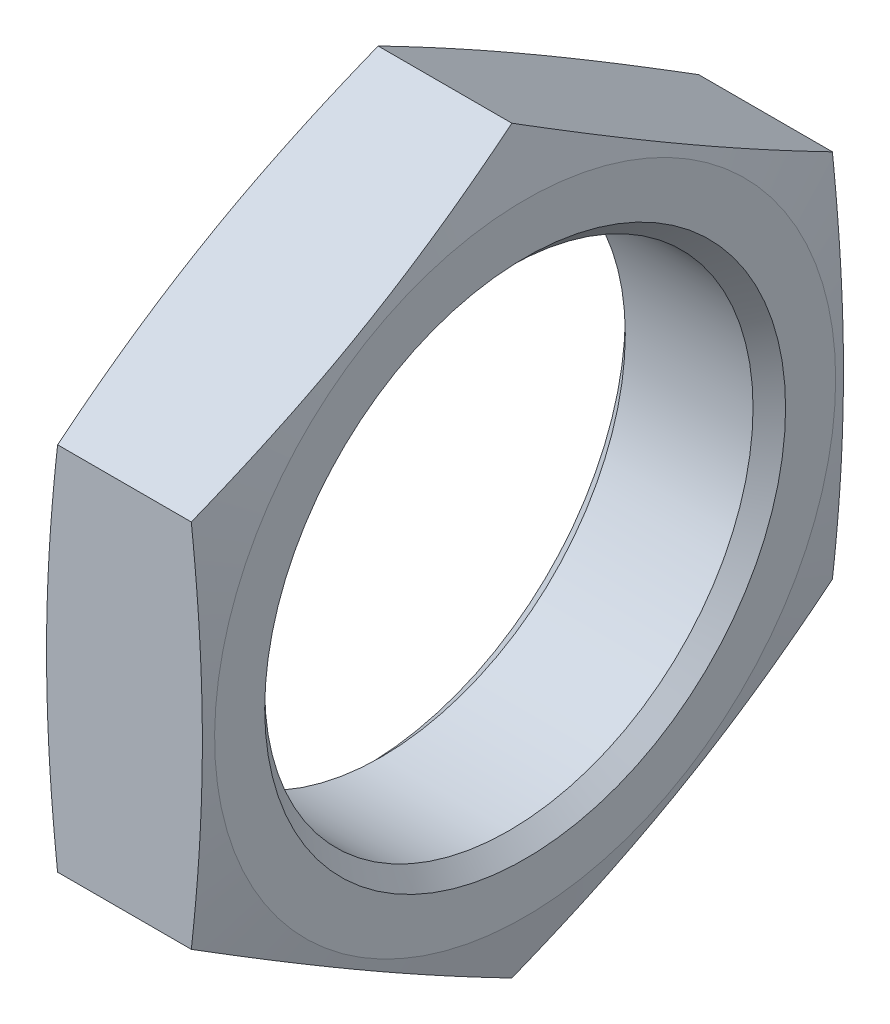
ISO-10303-21;
HEADER;
FILE_DESCRIPTION(('STEP AP214'),'2;1');
FILE_NAME('part.step','',(''),(''),'','','');
FILE_SCHEMA(('AUTOMOTIVE_DESIGN { 1 0 10303 214 1 1 1 1 }'));
ENDSEC;
DATA;
#1=APPLICATION_CONTEXT('core data for automotive mechanical design processes');
#2=APPLICATION_PROTOCOL_DEFINITION('international standard','automotive_design',2000,#1);
#3=PRODUCT_CONTEXT('',#1,'mechanical');
#4=PRODUCT('Part','Part','',(#3));
#5=PRODUCT_RELATED_PRODUCT_CATEGORY('part','',(#4));
#6=PRODUCT_DEFINITION_FORMATION('','',#4);
#7=PRODUCT_DEFINITION_CONTEXT('part definition',#1,'design');
#8=PRODUCT_DEFINITION('design','',#6,#7);
#9=PRODUCT_DEFINITION_SHAPE('','',#8);
#10=(LENGTH_UNIT() NAMED_UNIT(*) SI_UNIT(.MILLI.,.METRE.));
#11=(NAMED_UNIT(*) PLANE_ANGLE_UNIT() SI_UNIT($,.RADIAN.));
#12=(NAMED_UNIT(*) SI_UNIT($,.STERADIAN.) SOLID_ANGLE_UNIT());
#13=UNCERTAINTY_MEASURE_WITH_UNIT(LENGTH_MEASURE(1.E-05),#10,'distance_accuracy_value','');
#14=(GEOMETRIC_REPRESENTATION_CONTEXT(3) GLOBAL_UNCERTAINTY_ASSIGNED_CONTEXT((#13)) GLOBAL_UNIT_ASSIGNED_CONTEXT((#10,
#11,#12)) REPRESENTATION_CONTEXT('',''));
#15=CARTESIAN_POINT('',(0.,0.,0.));
#16=DIRECTION('',(0.,0.,1.));
#17=DIRECTION('',(1.,0.,0.));
#18=AXIS2_PLACEMENT_3D('',#15,#16,#17);
#19=CARTESIAN_POINT('',(0.,-13.,0.));
#20=DIRECTION('',(1.,0.,0.));
#21=DIRECTION('',(0.,0.,-1.));
#22=AXIS2_PLACEMENT_3D('',#19,#20,#21);
#23=PLANE('',#22);
#24=CARTESIAN_POINT('',(0.,0.,0.));
#25=DIRECTION('',(1.,0.,0.));
#26=DIRECTION('',(0.,0.,-1.));
#27=AXIS2_PLACEMENT_3D('',#24,#25,#26);
#28=CIRCLE('',#27,15.5);
#29=CARTESIAN_POINT('',(0.,0.,-15.5));
#30=VERTEX_POINT('',#29);
#31=EDGE_CURVE('E98',#30,#30,#28,.T.);
#32=ORIENTED_EDGE('',*,*,#31,.F.);
#33=EDGE_LOOP('',(#32));
#34=FACE_BOUND('',#33,.T.);
#35=CARTESIAN_POINT('',(0.,0.,0.));
#36=DIRECTION('',(1.,0.,0.));
#37=DIRECTION('',(0.,0.,-1.));
#38=AXIS2_PLACEMENT_3D('',#35,#36,#37);
#39=CIRCLE('',#38,13.);
#40=CARTESIAN_POINT('',(0.,0.,-13.));
#41=VERTEX_POINT('',#40);
#42=EDGE_CURVE('E217',#41,#41,#39,.T.);
#43=ORIENTED_EDGE('',*,*,#42,.T.);
#44=EDGE_LOOP('',(#43));
#45=FACE_BOUND('',#44,.T.);
#46=ADVANCED_FACE('F39',(#34,#45),#23,.F.);
#47=CARTESIAN_POINT('',(0.,0.,0.));
#48=DIRECTION('',(1.,0.,0.));
#49=DIRECTION('',(0.,0.,-1.));
#50=AXIS2_PLACEMENT_3D('',#47,#48,#49);
#51=CONICAL_SURFACE('',#50,15.5,1.35145307218971);
#52=CARTESIAN_POINT('',(3.08138082118048,-24.5721602463637,16.));
#53=CARTESIAN_POINT('',(2.94542948409883,-23.8442433589827,16.));
#54=CARTESIAN_POINT('',(2.8111494957726,-23.1160087423534,16.));
#55=CARTESIAN_POINT('',(2.54682523206958,-21.6587497199073,16.));
#56=CARTESIAN_POINT('',(2.41678108282317,-20.9297252912389,16.));
#57=CARTESIAN_POINT('',(2.16174598516709,-19.4702965053072,16.));
#58=CARTESIAN_POINT('',(2.03675841168863,-18.7398915562069,16.));
#59=CARTESIAN_POINT('',(1.79312680225305,-17.2780250403968,16.));
#60=CARTESIAN_POINT('',(1.67448272934855,-16.5465634798666,16.));
#61=CARTESIAN_POINT('',(1.44566080957647,-15.0864342231833,16.));
#62=CARTESIAN_POINT('',(1.33543997523493,-14.3577732964488,16.));
#63=CARTESIAN_POINT('',(1.12457472160042,-12.8990562585167,16.));
#64=CARTESIAN_POINT('',(1.02393032749282,-12.169000143655,16.));
#65=CARTESIAN_POINT('',(0.834439420296838,-10.7074069258439,16.));
#66=CARTESIAN_POINT('',(0.745591929957546,-9.97586995067187,16.));
#67=CARTESIAN_POINT('',(0.582254106535321,-8.51117723310516,16.));
#68=CARTESIAN_POINT('',(0.507763776507589,-7.77802149036609,16.));
#69=CARTESIAN_POINT('',(0.375404758541042,-6.30446452907683,16.));
#70=CARTESIAN_POINT('',(0.317669275092619,-5.56405117304472,16.));
#71=CARTESIAN_POINT('',(0.222315899806625,-4.08191882194834,16.));
#72=CARTESIAN_POINT('',(0.184697711398376,-3.34019984629336,16.));
#73=CARTESIAN_POINT('',(0.131677373971961,-1.85619022605193,16.));
#74=CARTESIAN_POINT('',(0.116268120502297,-1.11389984031248,16.));
#75=CARTESIAN_POINT('',(0.108585004053821,0.370802070375634,16.));
#76=CARTESIAN_POINT('',(0.116311108944219,1.11321359515462,16.));
#77=CARTESIAN_POINT('',(0.154469416243008,2.59937279775978,16.));
#78=CARTESIAN_POINT('',(0.184960601950223,3.34311893091831,16.));
#79=CARTESIAN_POINT('',(0.266945457863067,4.82944201998577,16.));
#80=CARTESIAN_POINT('',(0.318439426843486,5.5720189591115,16.));
#81=CARTESIAN_POINT('',(0.439866357760658,7.05597247759385,16.));
#82=CARTESIAN_POINT('',(0.509807496160809,7.79734837763225,16.));
#83=CARTESIAN_POINT('',(0.665248245131246,9.27844891219341,16.));
#84=CARTESIAN_POINT('',(0.750747886517592,10.0181735434427,16.));
#85=CARTESIAN_POINT('',(0.932841384510518,11.4821654611864,16.));
#86=CARTESIAN_POINT('',(1.02919730077095,12.206462629049,16.));
#87=CARTESIAN_POINT('',(1.23197874517596,13.6536533950972,16.));
#88=CARTESIAN_POINT('',(1.3384045041112,14.3765469607258,16.));
#89=CARTESIAN_POINT('',(1.559432015092,15.8211395146581,16.));
#90=CARTESIAN_POINT('',(1.67403446303304,16.5428383959244,16.));
#91=CARTESIAN_POINT('',(1.90986236143516,17.9851433387033,16.));
#92=CARTESIAN_POINT('',(2.03108776151939,18.7057494084856,16.));
#93=CARTESIAN_POINT('',(2.27895819689898,20.1462104505618,16.));
#94=CARTESIAN_POINT('',(2.40560457176019,20.8660651916526,16.));
#95=CARTESIAN_POINT('',(2.66330754514949,22.3049839883612,16.));
#96=CARTESIAN_POINT('',(2.79436414960298,23.0240480429153,16.));
#97=CARTESIAN_POINT('',(3.06009996520303,24.4614659139045,16.));
#98=CARTESIAN_POINT('',(3.19477898410298,25.1798197659415,16.));
#99=CARTESIAN_POINT('',(3.46715115816075,26.6159563579299,16.));
#100=CARTESIAN_POINT('',(3.60484431926878,27.3337390967511,16.));
#101=CARTESIAN_POINT('',(4.01966873780141,29.4759949293089,16.));
#102=CARTESIAN_POINT('',(4.30048012697847,30.8997553019664,16.));
#103=CARTESIAN_POINT('',(4.86912642919614,33.7458891286317,16.));
#104=CARTESIAN_POINT('',(5.15696144823449,35.168262561371,16.));
#105=CARTESIAN_POINT('',(5.73750479121511,38.0104986729067,16.));
#106=CARTESIAN_POINT('',(6.03020783227819,39.430362431922,16.));
#107=CARTESIAN_POINT('',(6.4721751989359,41.5595334664842,16.));
#108=CARTESIAN_POINT('',(6.61998124519669,42.2691441254021,16.));
#109=CARTESIAN_POINT('',(6.91645106081077,43.6881857106257,16.));
#110=CARTESIAN_POINT('',(7.06511482951659,44.3976166370666,16.));
#111=CARTESIAN_POINT('',(7.21415037216396,45.1069694875369,16.));
#112=B_SPLINE_CURVE_WITH_KNOTS('',3,(#52,#53,#54,#55,#56,#57,#58,#59,#60,#61,#62,#63,#64,#65,
#66,#67,#68,#69,#70,#71,#72,#73,#74,#75,#76,#77,#78,#79,#80,#81,#82,#83,#84,#85,#86,#87,#88,#89,
#90,#91,#92,#93,#94,#95,#96,#97,#98,#99,#100,#101,#102,#103,#104,#105,#106,#107,#108,#109,#110,
#111),.UNSPECIFIED.,.F.,.F.,(4,2,2,2,2,2,2,2,2,2,2,2,2,2,2,2,2,2,2,2,2,2,2,2,2,2,2,2,2,4),(0.,
2.2215174181477,4.44310092595417,6.66614352288232,8.88917317041034,11.0999723631927,
13.3107773700605,15.5213991202886,17.732021340936,19.9597650256971,22.1874758679878,
24.4144739260273,26.6414688911743,28.8742540111751,31.1070708947364,33.3408791127995,
35.5746917553189,37.7666414461568,39.9586413864496,42.1508281048648,44.3429981509408,
46.5357130627085,48.7284309206327,50.9210326366839,53.1136386815392,57.4671759983103,
61.8207790575721,66.1699313614857,68.3444528299292,70.5189726571143),.UNSPECIFIED.);
#113=CARTESIAN_POINT('',(0.663263066830451,-9.23760430703402,16.));
#114=VERTEX_POINT('',#113);
#115=CARTESIAN_POINT('',(0.663263066830451,9.23760430703402,16.));
#116=VERTEX_POINT('',#115);
#117=EDGE_CURVE('E171',#114,#116,#112,.T.);
#118=ORIENTED_EDGE('',*,*,#117,.T.);
#119=CARTESIAN_POINT('',(0.663288808803526,9.23748883698018,16.0002));
#120=CARTESIAN_POINT('',(0.577644596520293,9.62150569110165,15.3350632976988));
#121=CARTESIAN_POINT('',(0.499951945063873,10.0060070221062,14.6690874568211));
#122=CARTESIAN_POINT('',(0.36352252688607,10.7759503215658,13.3355065432098));
#123=CARTESIAN_POINT('',(0.304791002892421,11.1613925205382,12.6679010712086));
#124=CARTESIAN_POINT('',(0.209558157584958,11.9315952479053,11.3338708152807));
#125=CARTESIAN_POINT('',(0.172977975020494,12.3163532738543,10.6674503657171));
#126=CARTESIAN_POINT('',(0.123932964830005,13.0862097209779,9.33401988476455));
#127=CARTESIAN_POINT('',(0.111464968152866,13.4713080907645,8.66700994238228));
#128=CARTESIAN_POINT('',(0.111464968152866,14.2415048303376,7.33299005761772));
#129=CARTESIAN_POINT('',(0.123932964830005,14.6266032001241,6.66598011523545));
#130=CARTESIAN_POINT('',(0.172977975020494,15.3964596472478,5.33254963428286));
#131=CARTESIAN_POINT('',(0.209558157584958,15.7812176731967,4.66612918471935));
#132=CARTESIAN_POINT('',(0.304791002892421,16.5514204005639,3.33209892879136));
#133=CARTESIAN_POINT('',(0.36352252688607,16.9368625995362,2.66449345679022));
#134=CARTESIAN_POINT('',(0.499951945063874,17.7068058989958,1.33091254317892));
#135=CARTESIAN_POINT('',(0.577644596520294,18.0913072300004,0.664936702301148));
#136=CARTESIAN_POINT('',(0.663288808803526,18.4753240841219,-0.000199999999999242));
#137=B_SPLINE_CURVE_WITH_KNOTS('',3,(#119,#120,#121,#122,#123,#124,#125,#126,#127,#128,#129,
#130,#131,#132,#133,#134,#135,#136),.UNSPECIFIED.,.F.,.F.,(4,2,2,2,2,2,2,2,4),(0.,
2.3184642188721,4.63756894222746,6.94836809641305,9.25886352291191,11.5693589494108,
13.8801581035964,16.1992628269517,18.5177270458238),.UNSPECIFIED.);
#138=CARTESIAN_POINT('',(0.663263066830451,18.475208614068,0.));
#139=VERTEX_POINT('',#138);
#140=EDGE_CURVE('E177',#116,#139,#137,.T.);
#141=ORIENTED_EDGE('',*,*,#140,.T.);
#142=CARTESIAN_POINT('',(0.663288808803526,18.4753240841219,0.000200000000000793));
#143=CARTESIAN_POINT('',(0.577644596520294,18.0913072300004,-0.664936702301149));
#144=CARTESIAN_POINT('',(0.499951945063874,17.7068058989958,-1.33091254317892));
#145=CARTESIAN_POINT('',(0.36352252688607,16.9368625995362,-2.66449345679021));
#146=CARTESIAN_POINT('',(0.304791002892421,16.5514204005639,-3.33209892879135));
#147=CARTESIAN_POINT('',(0.209558157584958,15.7812176731967,-4.66612918471934));
#148=CARTESIAN_POINT('',(0.172977975020493,15.3964596472478,-5.33254963428286));
#149=CARTESIAN_POINT('',(0.123932964830005,14.6266032001241,-6.66598011523544));
#150=CARTESIAN_POINT('',(0.111464968152867,14.2415048303376,-7.33299005761772));
#151=CARTESIAN_POINT('',(0.111464968152867,13.4713080907645,-8.66700994238228));
#152=CARTESIAN_POINT('',(0.123932964830005,13.0862097209779,-9.33401988476455));
#153=CARTESIAN_POINT('',(0.172977975020493,12.3163532738543,-10.6674503657171));
#154=CARTESIAN_POINT('',(0.209558157584958,11.9315952479053,-11.3338708152807));
#155=CARTESIAN_POINT('',(0.304791002892421,11.1613925205382,-12.6679010712086));
#156=CARTESIAN_POINT('',(0.36352252688607,10.7759503215658,-13.3355065432098));
#157=CARTESIAN_POINT('',(0.499951945063873,10.0060070221062,-14.6690874568211));
#158=CARTESIAN_POINT('',(0.577644596520293,9.62150569110164,-15.3350632976989));
#159=CARTESIAN_POINT('',(0.663288808803526,9.23748883698018,-16.0002));
#160=B_SPLINE_CURVE_WITH_KNOTS('',3,(#142,#143,#144,#145,#146,#147,#148,#149,#150,#151,#152,
#153,#154,#155,#156,#157,#158,#159),.UNSPECIFIED.,.F.,.F.,(4,2,2,2,2,2,2,2,4),(0.,
2.3184642188721,4.63756894222746,6.94836809641305,9.25886352291191,11.5693589494108,
13.8801581035964,16.1992628269517,18.5177270458238),.UNSPECIFIED.);
#161=CARTESIAN_POINT('',(0.663263066830452,9.23760430703402,-16.));
#162=VERTEX_POINT('',#161);
#163=EDGE_CURVE('E147',#139,#162,#160,.T.);
#164=ORIENTED_EDGE('',*,*,#163,.T.);
#165=CARTESIAN_POINT('',(3.08138082118048,-24.5721602463637,-16.));
#166=CARTESIAN_POINT('',(2.94542948409883,-23.8442433589827,-16.));
#167=CARTESIAN_POINT('',(2.8111494957726,-23.1160087423534,-16.));
#168=CARTESIAN_POINT('',(2.54682523206958,-21.6587497199073,-16.));
#169=CARTESIAN_POINT('',(2.41678108282317,-20.9297252912389,-16.));
#170=CARTESIAN_POINT('',(2.16174598516709,-19.4702965053072,-16.));
#171=CARTESIAN_POINT('',(2.03675841168863,-18.7398915562069,-16.));
#172=CARTESIAN_POINT('',(1.79312680225305,-17.2780250403968,-16.));
#173=CARTESIAN_POINT('',(1.67448272934855,-16.5465634798666,-16.));
#174=CARTESIAN_POINT('',(1.44566080957647,-15.0864342231833,-16.));
#175=CARTESIAN_POINT('',(1.33543997523493,-14.3577732964488,-16.));
#176=CARTESIAN_POINT('',(1.12457472160042,-12.8990562585167,-16.));
#177=CARTESIAN_POINT('',(1.02393032749282,-12.169000143655,-16.));
#178=CARTESIAN_POINT('',(0.834439420296838,-10.7074069258439,-16.));
#179=CARTESIAN_POINT('',(0.745591929957546,-9.97586995067187,-16.));
#180=CARTESIAN_POINT('',(0.582254106535321,-8.51117723310516,-16.));
#181=CARTESIAN_POINT('',(0.507763776507589,-7.77802149036609,-16.));
#182=CARTESIAN_POINT('',(0.375404758541042,-6.30446452907683,-16.));
#183=CARTESIAN_POINT('',(0.317669275092619,-5.56405117304472,-16.));
#184=CARTESIAN_POINT('',(0.222315899806625,-4.08191882194834,-16.));
#185=CARTESIAN_POINT('',(0.184697711398376,-3.34019984629336,-16.));
#186=CARTESIAN_POINT('',(0.131677373971961,-1.85619022605193,-16.));
#187=CARTESIAN_POINT('',(0.116268120502297,-1.11389984031248,-16.));
#188=CARTESIAN_POINT('',(0.108585004053821,0.370802070375634,-16.));
#189=CARTESIAN_POINT('',(0.116311108944219,1.11321359515462,-16.));
#190=CARTESIAN_POINT('',(0.154469416243008,2.59937279775978,-16.));
#191=CARTESIAN_POINT('',(0.184960601950223,3.34311893091831,-16.));
#192=CARTESIAN_POINT('',(0.266945457863067,4.82944201998577,-16.));
#193=CARTESIAN_POINT('',(0.318439426843486,5.5720189591115,-16.));
#194=CARTESIAN_POINT('',(0.439866357760658,7.05597247759385,-16.));
#195=CARTESIAN_POINT('',(0.509807496160809,7.79734837763225,-16.));
#196=CARTESIAN_POINT('',(0.665248245131246,9.27844891219341,-16.));
#197=CARTESIAN_POINT('',(0.750747886517592,10.0181735434427,-16.));
#198=CARTESIAN_POINT('',(0.932841384510518,11.4821654611864,-16.));
#199=CARTESIAN_POINT('',(1.02919730077095,12.206462629049,-16.));
#200=CARTESIAN_POINT('',(1.23197874517596,13.6536533950972,-16.));
#201=CARTESIAN_POINT('',(1.3384045041112,14.3765469607258,-16.));
#202=CARTESIAN_POINT('',(1.559432015092,15.8211395146581,-16.));
#203=CARTESIAN_POINT('',(1.67403446303304,16.5428383959244,-16.));
#204=CARTESIAN_POINT('',(1.90986236143516,17.9851433387033,-16.));
#205=CARTESIAN_POINT('',(2.03108776151939,18.7057494084856,-16.));
#206=CARTESIAN_POINT('',(2.27895819689898,20.1462104505618,-16.));
#207=CARTESIAN_POINT('',(2.40560457176019,20.8660651916526,-16.));
#208=CARTESIAN_POINT('',(2.66330754514949,22.3049839883612,-16.));
#209=CARTESIAN_POINT('',(2.79436414960298,23.0240480429153,-16.));
#210=CARTESIAN_POINT('',(3.06009996520303,24.4614659139045,-16.));
#211=CARTESIAN_POINT('',(3.19477898410298,25.1798197659415,-16.));
#212=CARTESIAN_POINT('',(3.46715115816075,26.6159563579299,-16.));
#213=CARTESIAN_POINT('',(3.60484431926878,27.3337390967511,-16.));
#214=CARTESIAN_POINT('',(4.01966873780141,29.4759949293089,-16.));
#215=CARTESIAN_POINT('',(4.30048012697847,30.8997553019664,-16.));
#216=CARTESIAN_POINT('',(4.86912642919614,33.7458891286317,-16.));
#217=CARTESIAN_POINT('',(5.15696144823449,35.168262561371,-16.));
#218=CARTESIAN_POINT('',(5.73750479121511,38.0104986729067,-16.));
#219=CARTESIAN_POINT('',(6.03020783227819,39.430362431922,-16.));
#220=CARTESIAN_POINT('',(6.4721751989359,41.5595334664842,-16.));
#221=CARTESIAN_POINT('',(6.61998124519669,42.2691441254021,-16.));
#222=CARTESIAN_POINT('',(6.91645106081077,43.6881857106257,-16.));
#223=CARTESIAN_POINT('',(7.06511482951659,44.3976166370666,-16.));
#224=CARTESIAN_POINT('',(7.21415037216396,45.1069694875369,-16.));
#225=B_SPLINE_CURVE_WITH_KNOTS('',3,(#165,#166,#167,#168,#169,#170,#171,#172,#173,#174,#175,
#176,#177,#178,#179,#180,#181,#182,#183,#184,#185,#186,#187,#188,#189,#190,#191,#192,#193,#194,
#195,#196,#197,#198,#199,#200,#201,#202,#203,#204,#205,#206,#207,#208,#209,#210,#211,#212,#213,
#214,#215,#216,#217,#218,#219,#220,#221,#222,#223,#224),.UNSPECIFIED.,.F.,.F.,(4,2,2,2,2,2,2,2,
2,2,2,2,2,2,2,2,2,2,2,2,2,2,2,2,2,2,2,2,2,4),(0.,2.2215174181477,4.44310092595417,
6.66614352288232,8.88917317041034,11.0999723631927,13.3107773700605,15.5213991202886,
17.732021340936,19.9597650256971,22.1874758679878,24.4144739260273,26.6414688911743,
28.8742540111751,31.1070708947364,33.3408791127995,35.5746917553189,37.7666414461568,
39.9586413864496,42.1508281048648,44.3429981509408,46.5357130627085,48.7284309206327,
50.9210326366839,53.1136386815392,57.4671759983103,61.8207790575721,66.1699313614857,
68.3444528299292,70.5189726571143),.UNSPECIFIED.);
#226=CARTESIAN_POINT('',(0.663263066830451,-9.23760430703402,-16.));
#227=VERTEX_POINT('',#226);
#228=EDGE_CURVE('E105',#162,#227,#225,.F.);
#229=ORIENTED_EDGE('',*,*,#228,.T.);
#230=CARTESIAN_POINT('',(0.663288808803526,-9.23748883698018,-16.0002));
#231=CARTESIAN_POINT('',(0.577644596520293,-9.62150569110165,-15.3350632976988));
#232=CARTESIAN_POINT('',(0.499951945063873,-10.0060070221062,-14.6690874568211));
#233=CARTESIAN_POINT('',(0.36352252688607,-10.7759503215658,-13.3355065432098));
#234=CARTESIAN_POINT('',(0.304791002892421,-11.1613925205382,-12.6679010712086));
#235=CARTESIAN_POINT('',(0.209558157584958,-11.9315952479053,-11.3338708152807));
#236=CARTESIAN_POINT('',(0.172977975020494,-12.3163532738543,-10.6674503657171));
#237=CARTESIAN_POINT('',(0.123932964830005,-13.0862097209779,-9.33401988476455));
#238=CARTESIAN_POINT('',(0.111464968152866,-13.4713080907645,-8.66700994238228));
#239=CARTESIAN_POINT('',(0.111464968152866,-14.2415048303376,-7.33299005761772));
#240=CARTESIAN_POINT('',(0.123932964830005,-14.6266032001241,-6.66598011523545));
#241=CARTESIAN_POINT('',(0.172977975020494,-15.3964596472478,-5.33254963428286));
#242=CARTESIAN_POINT('',(0.209558157584958,-15.7812176731967,-4.66612918471935));
#243=CARTESIAN_POINT('',(0.304791002892421,-16.5514204005639,-3.33209892879136));
#244=CARTESIAN_POINT('',(0.36352252688607,-16.9368625995362,-2.66449345679022));
#245=CARTESIAN_POINT('',(0.499951945063874,-17.7068058989958,-1.33091254317892));
#246=CARTESIAN_POINT('',(0.577644596520294,-18.0913072300004,-0.664936702301148));
#247=CARTESIAN_POINT('',(0.663288808803526,-18.4753240841219,0.000199999999999242));
#248=B_SPLINE_CURVE_WITH_KNOTS('',3,(#230,#231,#232,#233,#234,#235,#236,#237,#238,#239,#240,
#241,#242,#243,#244,#245,#246,#247),.UNSPECIFIED.,.F.,.F.,(4,2,2,2,2,2,2,2,4),(0.,
2.3184642188721,4.63756894222746,6.94836809641305,9.25886352291191,11.5693589494108,
13.8801581035964,16.1992628269517,18.5177270458238),.UNSPECIFIED.);
#249=CARTESIAN_POINT('',(0.663263066830451,-18.475208614068,0.));
#250=VERTEX_POINT('',#249);
#251=EDGE_CURVE('E146',#227,#250,#248,.T.);
#252=ORIENTED_EDGE('',*,*,#251,.T.);
#253=CARTESIAN_POINT('',(0.663288808803526,-18.4753240841219,-0.000200000000000793));
#254=CARTESIAN_POINT('',(0.577644596520294,-18.0913072300004,0.664936702301149));
#255=CARTESIAN_POINT('',(0.499951945063874,-17.7068058989958,1.33091254317892));
#256=CARTESIAN_POINT('',(0.36352252688607,-16.9368625995362,2.66449345679021));
#257=CARTESIAN_POINT('',(0.304791002892421,-16.5514204005639,3.33209892879135));
#258=CARTESIAN_POINT('',(0.209558157584958,-15.7812176731967,4.66612918471934));
#259=CARTESIAN_POINT('',(0.172977975020493,-15.3964596472478,5.33254963428286));
#260=CARTESIAN_POINT('',(0.123932964830005,-14.6266032001241,6.66598011523544));
#261=CARTESIAN_POINT('',(0.111464968152867,-14.2415048303376,7.33299005761772));
#262=CARTESIAN_POINT('',(0.111464968152867,-13.4713080907645,8.66700994238228));
#263=CARTESIAN_POINT('',(0.123932964830005,-13.0862097209779,9.33401988476455));
#264=CARTESIAN_POINT('',(0.172977975020493,-12.3163532738543,10.6674503657171));
#265=CARTESIAN_POINT('',(0.209558157584958,-11.9315952479053,11.3338708152807));
#266=CARTESIAN_POINT('',(0.304791002892421,-11.1613925205382,12.6679010712086));
#267=CARTESIAN_POINT('',(0.36352252688607,-10.7759503215658,13.3355065432098));
#268=CARTESIAN_POINT('',(0.499951945063873,-10.0060070221062,14.6690874568211));
#269=CARTESIAN_POINT('',(0.577644596520293,-9.62150569110164,15.3350632976989));
#270=CARTESIAN_POINT('',(0.663288808803526,-9.23748883698018,16.0002));
#271=B_SPLINE_CURVE_WITH_KNOTS('',3,(#253,#254,#255,#256,#257,#258,#259,#260,#261,#262,#263,
#264,#265,#266,#267,#268,#269,#270),.UNSPECIFIED.,.F.,.F.,(4,2,2,2,2,2,2,2,4),(0.,
2.3184642188721,4.63756894222746,6.94836809641305,9.25886352291191,11.5693589494108,
13.8801581035964,16.1992628269517,18.5177270458238),.UNSPECIFIED.);
#272=EDGE_CURVE('E166',#250,#114,#271,.T.);
#273=ORIENTED_EDGE('',*,*,#272,.T.);
#274=EDGE_LOOP('',(#118,#141,#164,#229,#252,#273));
#275=FACE_BOUND('',#274,.T.);
#276=ORIENTED_EDGE('',*,*,#31,.T.);
#277=EDGE_LOOP('',(#276));
#278=FACE_BOUND('',#277,.T.);
#279=ADVANCED_FACE('F156',(#275,#278),#51,.T.);
#280=CARTESIAN_POINT('',(4.5,0.,0.));
#281=DIRECTION('',(-1.,0.,0.));
#282=DIRECTION('',(0.,0.,1.));
#283=AXIS2_PLACEMENT_3D('',#280,#281,#282);
#284=CONICAL_SURFACE('',#283,31.2,1.35145307218971);
#285=CARTESIAN_POINT('',(7.33671119119647,9.23748883698018,-16.0002));
#286=CARTESIAN_POINT('',(7.4223554034797,9.62150569110164,-15.3350632976988));
#287=CARTESIAN_POINT('',(7.50004805493612,10.0060070221062,-14.6690874568211));
#288=CARTESIAN_POINT('',(7.63647747311393,10.7759503215658,-13.3355065432098));
#289=CARTESIAN_POINT('',(7.69520899710757,11.1613925205382,-12.6679010712086));
#290=CARTESIAN_POINT('',(7.79044184241504,11.9315952479053,-11.3338708152807));
#291=CARTESIAN_POINT('',(7.8270220249795,12.3163532738543,-10.6674503657171));
#292=CARTESIAN_POINT('',(7.87606703516999,13.0862097209779,-9.33401988476455));
#293=CARTESIAN_POINT('',(7.88853503184713,13.4713080907645,-8.66700994238228));
#294=CARTESIAN_POINT('',(7.88853503184713,14.2415048303376,-7.33299005761772));
#295=CARTESIAN_POINT('',(7.87606703516999,14.6266032001241,-6.66598011523544));
#296=CARTESIAN_POINT('',(7.8270220249795,15.3964596472478,-5.33254963428286));
#297=CARTESIAN_POINT('',(7.79044184241504,15.7812176731967,-4.66612918471934));
#298=CARTESIAN_POINT('',(7.69520899710757,16.5514204005639,-3.33209892879135));
#299=CARTESIAN_POINT('',(7.63647747311393,16.9368625995362,-2.66449345679021));
#300=CARTESIAN_POINT('',(7.50004805493612,17.7068058989958,-1.33091254317892));
#301=CARTESIAN_POINT('',(7.4223554034797,18.0913072300004,-0.664936702301145));
#302=CARTESIAN_POINT('',(7.33671119119647,18.4753240841219,0.000200000000002278));
#303=B_SPLINE_CURVE_WITH_KNOTS('',3,(#285,#286,#287,#288,#289,#290,#291,#292,#293,#294,#295,
#296,#297,#298,#299,#300,#301,#302),.UNSPECIFIED.,.F.,.F.,(4,2,2,2,2,2,2,2,4),(0.,
2.3184642188721,4.63756894222746,6.94836809641305,9.25886352291191,11.5693589494108,
13.8801581035964,16.1992628269517,18.5177270458238),.UNSPECIFIED.);
#304=CARTESIAN_POINT('',(7.33673693316954,9.23760430703402,-16.));
#305=VERTEX_POINT('',#304);
#306=CARTESIAN_POINT('',(7.33673693316954,18.475208614068,0.));
#307=VERTEX_POINT('',#306);
#308=EDGE_CURVE('E93',#305,#307,#303,.T.);
#309=ORIENTED_EDGE('',*,*,#308,.T.);
#310=CARTESIAN_POINT('',(7.33671119119647,18.4753240841219,-0.000200000000000057));
#311=CARTESIAN_POINT('',(7.4223554034797,18.0913072300004,0.664936702301147));
#312=CARTESIAN_POINT('',(7.50004805493612,17.7068058989958,1.33091254317892));
#313=CARTESIAN_POINT('',(7.63647747311393,16.9368625995362,2.66449345679021));
#314=CARTESIAN_POINT('',(7.69520899710757,16.5514204005639,3.33209892879136));
#315=CARTESIAN_POINT('',(7.79044184241504,15.7812176731967,4.66612918471934));
#316=CARTESIAN_POINT('',(7.8270220249795,15.3964596472478,5.33254963428286));
#317=CARTESIAN_POINT('',(7.87606703516999,14.6266032001241,6.66598011523544));
#318=CARTESIAN_POINT('',(7.88853503184713,14.2415048303376,7.33299005761772));
#319=CARTESIAN_POINT('',(7.88853503184713,13.4713080907645,8.66700994238228));
#320=CARTESIAN_POINT('',(7.87606703516999,13.0862097209779,9.33401988476455));
#321=CARTESIAN_POINT('',(7.8270220249795,12.3163532738543,10.6674503657171));
#322=CARTESIAN_POINT('',(7.79044184241504,11.9315952479053,11.3338708152807));
#323=CARTESIAN_POINT('',(7.69520899710757,11.1613925205382,12.6679010712086));
#324=CARTESIAN_POINT('',(7.63647747311393,10.7759503215658,13.3355065432098));
#325=CARTESIAN_POINT('',(7.50004805493612,10.0060070221062,14.6690874568211));
#326=CARTESIAN_POINT('',(7.4223554034797,9.62150569110165,15.3350632976988));
#327=CARTESIAN_POINT('',(7.33671119119647,9.23748883698018,16.0002));
#328=B_SPLINE_CURVE_WITH_KNOTS('',3,(#310,#311,#312,#313,#314,#315,#316,#317,#318,#319,#320,
#321,#322,#323,#324,#325,#326,#327),.UNSPECIFIED.,.F.,.F.,(4,2,2,2,2,2,2,2,4),(0.,
2.3184642188721,4.63756894222746,6.94836809641305,9.25886352291191,11.5693589494108,
13.8801581035964,16.1992628269517,18.5177270458238),.UNSPECIFIED.);
#329=CARTESIAN_POINT('',(7.33673693316954,9.23760430703402,16.));
#330=VERTEX_POINT('',#329);
#331=EDGE_CURVE('E11',#307,#330,#328,.T.);
#332=ORIENTED_EDGE('',*,*,#331,.T.);
#333=CARTESIAN_POINT('',(4.91861917881952,-24.5721602463637,16.));
#334=CARTESIAN_POINT('',(5.05457051590116,-23.8442433589827,16.));
#335=CARTESIAN_POINT('',(5.1888505042274,-23.1160087423534,16.));
#336=CARTESIAN_POINT('',(5.45317476793042,-21.6587497199073,16.));
#337=CARTESIAN_POINT('',(5.58321891717682,-20.9297252912389,16.));
#338=CARTESIAN_POINT('',(5.83825401483291,-19.4702965053072,16.));
#339=CARTESIAN_POINT('',(5.96324158831137,-18.7398915562069,16.));
#340=CARTESIAN_POINT('',(6.20687319774695,-17.2780250403968,16.));
#341=CARTESIAN_POINT('',(6.32551727065145,-16.5465634798666,16.));
#342=CARTESIAN_POINT('',(6.55433919042352,-15.0864342231833,16.));
#343=CARTESIAN_POINT('',(6.66456002476507,-14.3577732964488,16.));
#344=CARTESIAN_POINT('',(6.87542527839958,-12.8990562585167,16.));
#345=CARTESIAN_POINT('',(6.97606967250718,-12.169000143655,16.));
#346=CARTESIAN_POINT('',(7.16556057970316,-10.7074069258439,16.));
#347=CARTESIAN_POINT('',(7.25440807004245,-9.97586995067187,16.));
#348=CARTESIAN_POINT('',(7.41774589346467,-8.51117723310516,16.));
#349=CARTESIAN_POINT('',(7.49223622349241,-7.77802149036609,16.));
#350=CARTESIAN_POINT('',(7.62459524145895,-6.30446452907683,16.));
#351=CARTESIAN_POINT('',(7.68233072490738,-5.56405117304472,16.));
#352=CARTESIAN_POINT('',(7.77768410019337,-4.08191882194834,16.));
#353=CARTESIAN_POINT('',(7.81530228860162,-3.34019984629336,16.));
#354=CARTESIAN_POINT('',(7.86832262602803,-1.85619022605193,16.));
#355=CARTESIAN_POINT('',(7.8837318794977,-1.11389984031248,16.));
#356=CARTESIAN_POINT('',(7.89141499594617,0.370802070375634,16.));
#357=CARTESIAN_POINT('',(7.88368889105578,1.11321359515462,16.));
#358=CARTESIAN_POINT('',(7.84553058375699,2.59937279775978,16.));
#359=CARTESIAN_POINT('',(7.81503939804977,3.34311893091831,16.));
#360=CARTESIAN_POINT('',(7.73305454213693,4.82944201998577,16.));
#361=CARTESIAN_POINT('',(7.68156057315651,5.5720189591115,16.));
#362=CARTESIAN_POINT('',(7.56013364223934,7.05597247759385,16.));
#363=CARTESIAN_POINT('',(7.49019250383919,7.79734837763225,16.));
#364=CARTESIAN_POINT('',(7.33475175486875,9.27844891219342,16.));
#365=CARTESIAN_POINT('',(7.2492521134824,10.0181735434427,16.));
#366=CARTESIAN_POINT('',(7.06715861548948,11.4821654611864,16.));
#367=CARTESIAN_POINT('',(6.97080269922905,12.2064626290491,16.));
#368=CARTESIAN_POINT('',(6.76802125482403,13.6536533950972,16.));
#369=CARTESIAN_POINT('',(6.66159549588879,14.3765469607258,16.));
#370=CARTESIAN_POINT('',(6.440567984908,15.8211395146581,16.));
#371=CARTESIAN_POINT('',(6.32596553696696,16.5428383959244,16.));
#372=CARTESIAN_POINT('',(6.09013763856483,17.9851433387034,16.));
#373=CARTESIAN_POINT('',(5.9689122384806,18.7057494084856,16.));
#374=CARTESIAN_POINT('',(5.72104180310101,20.1462104505618,16.));
#375=CARTESIAN_POINT('',(5.59439542823981,20.8660651916526,16.));
#376=CARTESIAN_POINT('',(5.33669245485051,22.3049839883612,16.));
#377=CARTESIAN_POINT('',(5.20563585039701,23.0240480429154,16.));
#378=CARTESIAN_POINT('',(4.93990003479696,24.4614659139045,16.));
#379=CARTESIAN_POINT('',(4.80522101589701,25.1798197659415,16.));
#380=CARTESIAN_POINT('',(4.53284884183924,26.6159563579299,16.));
#381=CARTESIAN_POINT('',(4.39515568073121,27.3337390967511,16.));
#382=CARTESIAN_POINT('',(3.98033126219859,29.4759949293089,16.));
#383=CARTESIAN_POINT('',(3.69951987302152,30.8997553019664,16.));
#384=CARTESIAN_POINT('',(3.13087357080385,33.7458891286317,16.));
#385=CARTESIAN_POINT('',(2.8430385517655,35.168262561371,16.));
#386=CARTESIAN_POINT('',(2.26249520878488,38.0104986729067,16.));
#387=CARTESIAN_POINT('',(1.9697921677218,39.430362431922,16.));
#388=CARTESIAN_POINT('',(1.5278248010641,41.5595334664842,16.));
#389=CARTESIAN_POINT('',(1.3800187548033,42.2691441254021,16.));
#390=CARTESIAN_POINT('',(1.08354893918922,43.6881857106257,16.));
#391=CARTESIAN_POINT('',(0.934885170483406,44.3976166370666,16.));
#392=CARTESIAN_POINT('',(0.785849627836035,45.1069694875369,16.));
#393=B_SPLINE_CURVE_WITH_KNOTS('',3,(#333,#334,#335,#336,#337,#338,#339,#340,#341,#342,#343,
#344,#345,#346,#347,#348,#349,#350,#351,#352,#353,#354,#355,#356,#357,#358,#359,#360,#361,#362,
#363,#364,#365,#366,#367,#368,#369,#370,#371,#372,#373,#374,#375,#376,#377,#378,#379,#380,#381,
#382,#383,#384,#385,#386,#387,#388,#389,#390,#391,#392),.UNSPECIFIED.,.F.,.F.,(4,2,2,2,2,2,2,2,
2,2,2,2,2,2,2,2,2,2,2,2,2,2,2,2,2,2,2,2,2,4),(0.,2.2215174181477,4.44310092595417,
6.66614352288232,8.88917317041036,11.0999723631927,13.3107773700605,15.5213991202886,
17.732021340936,19.9597650256971,22.1874758679878,24.4144739260273,26.6414688911743,
28.8742540111751,31.1070708947364,33.3408791127995,35.5746917553189,37.7666414461569,
39.9586413864496,42.1508281048648,44.3429981509408,46.5357130627085,48.7284309206327,
50.9210326366839,53.1136386815392,57.4671759983103,61.8207790575721,66.1699313614857,
68.3444528299292,70.5189726571143),.UNSPECIFIED.);
#394=CARTESIAN_POINT('',(7.33673693316954,-9.23760430703402,16.));
#395=VERTEX_POINT('',#394);
#396=EDGE_CURVE('E51',#330,#395,#393,.F.);
#397=ORIENTED_EDGE('',*,*,#396,.T.);
#398=CARTESIAN_POINT('',(7.33671119119647,-9.23748883698018,16.0002));
#399=CARTESIAN_POINT('',(7.4223554034797,-9.62150569110164,15.3350632976988));
#400=CARTESIAN_POINT('',(7.50004805493612,-10.0060070221062,14.6690874568211));
#401=CARTESIAN_POINT('',(7.63647747311393,-10.7759503215658,13.3355065432098));
#402=CARTESIAN_POINT('',(7.69520899710757,-11.1613925205382,12.6679010712086));
#403=CARTESIAN_POINT('',(7.79044184241504,-11.9315952479053,11.3338708152807));
#404=CARTESIAN_POINT('',(7.8270220249795,-12.3163532738543,10.6674503657171));
#405=CARTESIAN_POINT('',(7.87606703516999,-13.0862097209779,9.33401988476455));
#406=CARTESIAN_POINT('',(7.88853503184713,-13.4713080907645,8.66700994238228));
#407=CARTESIAN_POINT('',(7.88853503184713,-14.2415048303376,7.33299005761772));
#408=CARTESIAN_POINT('',(7.87606703516999,-14.6266032001241,6.66598011523544));
#409=CARTESIAN_POINT('',(7.8270220249795,-15.3964596472478,5.33254963428286));
#410=CARTESIAN_POINT('',(7.79044184241504,-15.7812176731967,4.66612918471934));
#411=CARTESIAN_POINT('',(7.69520899710757,-16.5514204005639,3.33209892879135));
#412=CARTESIAN_POINT('',(7.63647747311393,-16.9368625995362,2.66449345679021));
#413=CARTESIAN_POINT('',(7.50004805493612,-17.7068058989958,1.33091254317892));
#414=CARTESIAN_POINT('',(7.4223554034797,-18.0913072300004,0.664936702301145));
#415=CARTESIAN_POINT('',(7.33671119119647,-18.4753240841219,-0.000200000000002278));
#416=B_SPLINE_CURVE_WITH_KNOTS('',3,(#398,#399,#400,#401,#402,#403,#404,#405,#406,#407,#408,
#409,#410,#411,#412,#413,#414,#415),.UNSPECIFIED.,.F.,.F.,(4,2,2,2,2,2,2,2,4),(0.,
2.3184642188721,4.63756894222746,6.94836809641305,9.25886352291191,11.5693589494108,
13.8801581035964,16.1992628269517,18.5177270458238),.UNSPECIFIED.);
#417=CARTESIAN_POINT('',(7.33673693316954,-18.475208614068,0.));
#418=VERTEX_POINT('',#417);
#419=EDGE_CURVE('E115',#395,#418,#416,.T.);
#420=ORIENTED_EDGE('',*,*,#419,.T.);
#421=CARTESIAN_POINT('',(7.33671119119647,-18.4753240841219,0.000200000000000057));
#422=CARTESIAN_POINT('',(7.4223554034797,-18.0913072300004,-0.664936702301147));
#423=CARTESIAN_POINT('',(7.50004805493612,-17.7068058989958,-1.33091254317892));
#424=CARTESIAN_POINT('',(7.63647747311393,-16.9368625995362,-2.66449345679021));
#425=CARTESIAN_POINT('',(7.69520899710757,-16.5514204005639,-3.33209892879136));
#426=CARTESIAN_POINT('',(7.79044184241504,-15.7812176731967,-4.66612918471934));
#427=CARTESIAN_POINT('',(7.8270220249795,-15.3964596472478,-5.33254963428286));
#428=CARTESIAN_POINT('',(7.87606703516999,-14.6266032001241,-6.66598011523544));
#429=CARTESIAN_POINT('',(7.88853503184713,-14.2415048303376,-7.33299005761772));
#430=CARTESIAN_POINT('',(7.88853503184713,-13.4713080907645,-8.66700994238228));
#431=CARTESIAN_POINT('',(7.87606703516999,-13.0862097209779,-9.33401988476455));
#432=CARTESIAN_POINT('',(7.8270220249795,-12.3163532738543,-10.6674503657171));
#433=CARTESIAN_POINT('',(7.79044184241504,-11.9315952479053,-11.3338708152807));
#434=CARTESIAN_POINT('',(7.69520899710757,-11.1613925205382,-12.6679010712086));
#435=CARTESIAN_POINT('',(7.63647747311393,-10.7759503215658,-13.3355065432098));
#436=CARTESIAN_POINT('',(7.50004805493612,-10.0060070221062,-14.6690874568211));
#437=CARTESIAN_POINT('',(7.4223554034797,-9.62150569110165,-15.3350632976988));
#438=CARTESIAN_POINT('',(7.33671119119647,-9.23748883698018,-16.0002));
#439=B_SPLINE_CURVE_WITH_KNOTS('',3,(#421,#422,#423,#424,#425,#426,#427,#428,#429,#430,#431,
#432,#433,#434,#435,#436,#437,#438),.UNSPECIFIED.,.F.,.F.,(4,2,2,2,2,2,2,2,4),(0.,
2.3184642188721,4.63756894222746,6.94836809641305,9.25886352291191,11.5693589494108,
13.8801581035964,16.1992628269517,18.5177270458238),.UNSPECIFIED.);
#440=CARTESIAN_POINT('',(7.33673693316954,-9.23760430703402,-16.));
#441=VERTEX_POINT('',#440);
#442=EDGE_CURVE('E113',#418,#441,#439,.T.);
#443=ORIENTED_EDGE('',*,*,#442,.T.);
#444=CARTESIAN_POINT('',(4.91861917881952,-24.5721602463637,-16.));
#445=CARTESIAN_POINT('',(5.05457051590116,-23.8442433589827,-16.));
#446=CARTESIAN_POINT('',(5.1888505042274,-23.1160087423534,-16.));
#447=CARTESIAN_POINT('',(5.45317476793042,-21.6587497199073,-16.));
#448=CARTESIAN_POINT('',(5.58321891717682,-20.9297252912389,-16.));
#449=CARTESIAN_POINT('',(5.83825401483291,-19.4702965053072,-16.));
#450=CARTESIAN_POINT('',(5.96324158831137,-18.7398915562069,-16.));
#451=CARTESIAN_POINT('',(6.20687319774695,-17.2780250403968,-16.));
#452=CARTESIAN_POINT('',(6.32551727065145,-16.5465634798666,-16.));
#453=CARTESIAN_POINT('',(6.55433919042352,-15.0864342231833,-16.));
#454=CARTESIAN_POINT('',(6.66456002476507,-14.3577732964488,-16.));
#455=CARTESIAN_POINT('',(6.87542527839958,-12.8990562585167,-16.));
#456=CARTESIAN_POINT('',(6.97606967250718,-12.169000143655,-16.));
#457=CARTESIAN_POINT('',(7.16556057970316,-10.7074069258439,-16.));
#458=CARTESIAN_POINT('',(7.25440807004245,-9.97586995067187,-16.));
#459=CARTESIAN_POINT('',(7.41774589346467,-8.51117723310516,-16.));
#460=CARTESIAN_POINT('',(7.49223622349241,-7.77802149036609,-16.));
#461=CARTESIAN_POINT('',(7.62459524145895,-6.30446452907683,-16.));
#462=CARTESIAN_POINT('',(7.68233072490738,-5.56405117304472,-16.));
#463=CARTESIAN_POINT('',(7.77768410019337,-4.08191882194834,-16.));
#464=CARTESIAN_POINT('',(7.81530228860162,-3.34019984629336,-16.));
#465=CARTESIAN_POINT('',(7.86832262602803,-1.85619022605193,-16.));
#466=CARTESIAN_POINT('',(7.8837318794977,-1.11389984031248,-16.));
#467=CARTESIAN_POINT('',(7.89141499594617,0.370802070375634,-16.));
#468=CARTESIAN_POINT('',(7.88368889105578,1.11321359515462,-16.));
#469=CARTESIAN_POINT('',(7.84553058375699,2.59937279775978,-16.));
#470=CARTESIAN_POINT('',(7.81503939804977,3.34311893091831,-16.));
#471=CARTESIAN_POINT('',(7.73305454213693,4.82944201998577,-16.));
#472=CARTESIAN_POINT('',(7.68156057315651,5.5720189591115,-16.));
#473=CARTESIAN_POINT('',(7.56013364223934,7.05597247759385,-16.));
#474=CARTESIAN_POINT('',(7.49019250383919,7.79734837763225,-16.));
#475=CARTESIAN_POINT('',(7.33475175486875,9.27844891219342,-16.));
#476=CARTESIAN_POINT('',(7.2492521134824,10.0181735434427,-16.));
#477=CARTESIAN_POINT('',(7.06715861548948,11.4821654611864,-16.));
#478=CARTESIAN_POINT('',(6.97080269922905,12.2064626290491,-16.));
#479=CARTESIAN_POINT('',(6.76802125482403,13.6536533950972,-16.));
#480=CARTESIAN_POINT('',(6.66159549588879,14.3765469607258,-16.));
#481=CARTESIAN_POINT('',(6.440567984908,15.8211395146581,-16.));
#482=CARTESIAN_POINT('',(6.32596553696696,16.5428383959244,-16.));
#483=CARTESIAN_POINT('',(6.09013763856483,17.9851433387034,-16.));
#484=CARTESIAN_POINT('',(5.9689122384806,18.7057494084856,-16.));
#485=CARTESIAN_POINT('',(5.72104180310101,20.1462104505618,-16.));
#486=CARTESIAN_POINT('',(5.59439542823981,20.8660651916526,-16.));
#487=CARTESIAN_POINT('',(5.33669245485051,22.3049839883612,-16.));
#488=CARTESIAN_POINT('',(5.20563585039701,23.0240480429154,-16.));
#489=CARTESIAN_POINT('',(4.93990003479696,24.4614659139045,-16.));
#490=CARTESIAN_POINT('',(4.80522101589701,25.1798197659415,-16.));
#491=CARTESIAN_POINT('',(4.53284884183924,26.6159563579299,-16.));
#492=CARTESIAN_POINT('',(4.39515568073121,27.3337390967511,-16.));
#493=CARTESIAN_POINT('',(3.98033126219859,29.4759949293089,-16.));
#494=CARTESIAN_POINT('',(3.69951987302152,30.8997553019664,-16.));
#495=CARTESIAN_POINT('',(3.13087357080385,33.7458891286317,-16.));
#496=CARTESIAN_POINT('',(2.8430385517655,35.168262561371,-16.));
#497=CARTESIAN_POINT('',(2.26249520878488,38.0104986729067,-16.));
#498=CARTESIAN_POINT('',(1.9697921677218,39.430362431922,-16.));
#499=CARTESIAN_POINT('',(1.5278248010641,41.5595334664842,-16.));
#500=CARTESIAN_POINT('',(1.3800187548033,42.2691441254021,-16.));
#501=CARTESIAN_POINT('',(1.08354893918922,43.6881857106257,-16.));
#502=CARTESIAN_POINT('',(0.934885170483406,44.3976166370666,-16.));
#503=CARTESIAN_POINT('',(0.785849627836035,45.1069694875369,-16.));
#504=B_SPLINE_CURVE_WITH_KNOTS('',3,(#444,#445,#446,#447,#448,#449,#450,#451,#452,#453,#454,
#455,#456,#457,#458,#459,#460,#461,#462,#463,#464,#465,#466,#467,#468,#469,#470,#471,#472,#473,
#474,#475,#476,#477,#478,#479,#480,#481,#482,#483,#484,#485,#486,#487,#488,#489,#490,#491,#492,
#493,#494,#495,#496,#497,#498,#499,#500,#501,#502,#503),.UNSPECIFIED.,.F.,.F.,(4,2,2,2,2,2,2,2,
2,2,2,2,2,2,2,2,2,2,2,2,2,2,2,2,2,2,2,2,2,4),(0.,2.2215174181477,4.44310092595417,
6.66614352288232,8.88917317041036,11.0999723631927,13.3107773700605,15.5213991202886,
17.732021340936,19.9597650256971,22.1874758679878,24.4144739260273,26.6414688911743,
28.8742540111751,31.1070708947364,33.3408791127995,35.5746917553189,37.7666414461569,
39.9586413864496,42.1508281048648,44.3429981509408,46.5357130627085,48.7284309206327,
50.9210326366839,53.1136386815392,57.4671759983103,61.8207790575721,66.1699313614857,
68.3444528299292,70.5189726571143),.UNSPECIFIED.);
#505=EDGE_CURVE('E97',#441,#305,#504,.T.);
#506=ORIENTED_EDGE('',*,*,#505,.T.);
#507=EDGE_LOOP('',(#309,#332,#397,#420,#443,#506));
#508=FACE_BOUND('',#507,.T.);
#509=CARTESIAN_POINT('',(7.99999999999999,0.,0.));
#510=DIRECTION('',(1.,0.,0.));
#511=DIRECTION('',(0.,0.,-1.));
#512=AXIS2_PLACEMENT_3D('',#509,#510,#511);
#513=CIRCLE('',#512,15.5);
#514=CARTESIAN_POINT('',(7.99999999999999,0.,-15.5));
#515=VERTEX_POINT('',#514);
#516=EDGE_CURVE('E231',#515,#515,#513,.T.);
#517=ORIENTED_EDGE('',*,*,#516,.F.);
#518=EDGE_LOOP('',(#517));
#519=FACE_BOUND('',#518,.T.);
#520=ADVANCED_FACE('F110',(#508,#519),#284,.T.);
#521=CARTESIAN_POINT('',(7.99999999999999,-15.5,0.));
#522=DIRECTION('',(-1.,0.,0.));
#523=DIRECTION('',(0.,0.,1.));
#524=AXIS2_PLACEMENT_3D('',#521,#522,#523);
#525=PLANE('',#524);
#526=CARTESIAN_POINT('',(7.99999999999999,0.,0.));
#527=DIRECTION('',(1.,0.,0.));
#528=DIRECTION('',(0.,0.,-1.));
#529=AXIS2_PLACEMENT_3D('',#526,#527,#528);
#530=CIRCLE('',#529,13.);
#531=CARTESIAN_POINT('',(7.99999999999999,0.,-13.));
#532=VERTEX_POINT('',#531);
#533=EDGE_CURVE('E228',#532,#532,#530,.T.);
#534=ORIENTED_EDGE('',*,*,#533,.F.);
#535=EDGE_LOOP('',(#534));
#536=FACE_BOUND('',#535,.T.);
#537=ORIENTED_EDGE('',*,*,#516,.T.);
#538=EDGE_LOOP('',(#537));
#539=FACE_BOUND('',#538,.T.);
#540=ADVANCED_FACE('F252',(#536,#539),#525,.F.);
#541=CARTESIAN_POINT('',(7.99999999999999,0.,0.));
#542=DIRECTION('',(1.,0.,0.));
#543=DIRECTION('',(0.,0.,-1.));
#544=AXIS2_PLACEMENT_3D('',#541,#542,#543);
#545=CONICAL_SURFACE('',#544,13.,0.785398163397449);
#546=CARTESIAN_POINT('',(7.18799999999999,0.,0.));
#547=DIRECTION('',(1.,0.,0.));
#548=DIRECTION('',(0.,0.,-1.));
#549=AXIS2_PLACEMENT_3D('',#546,#547,#548);
#550=CIRCLE('',#549,12.188);
#551=CARTESIAN_POINT('',(7.18799999999999,0.,-12.188));
#552=VERTEX_POINT('',#551);
#553=EDGE_CURVE('E223',#552,#552,#550,.T.);
#554=ORIENTED_EDGE('',*,*,#553,.F.);
#555=EDGE_LOOP('',(#554));
#556=FACE_BOUND('',#555,.T.);
#557=ORIENTED_EDGE('',*,*,#533,.T.);
#558=EDGE_LOOP('',(#557));
#559=FACE_BOUND('',#558,.T.);
#560=ADVANCED_FACE('F258',(#556,#559),#545,.F.);
#561=CARTESIAN_POINT('',(0.,0.,0.));
#562=DIRECTION('',(1.,0.,0.));
#563=DIRECTION('',(0.,0.,-1.));
#564=AXIS2_PLACEMENT_3D('',#561,#562,#563);
#565=CYLINDRICAL_SURFACE('',#564,12.188);
#566=CARTESIAN_POINT('',(0.811999999999999,0.,0.));
#567=DIRECTION('',(1.,0.,0.));
#568=DIRECTION('',(0.,0.,-1.));
#569=AXIS2_PLACEMENT_3D('',#566,#567,#568);
#570=CIRCLE('',#569,12.188);
#571=CARTESIAN_POINT('',(0.811999999999999,0.,-12.188));
#572=VERTEX_POINT('',#571);
#573=EDGE_CURVE('E219',#572,#572,#570,.T.);
#574=ORIENTED_EDGE('',*,*,#573,.F.);
#575=EDGE_LOOP('',(#574));
#576=FACE_BOUND('',#575,.T.);
#577=ORIENTED_EDGE('',*,*,#553,.T.);
#578=EDGE_LOOP('',(#577));
#579=FACE_BOUND('',#578,.T.);
#580=ADVANCED_FACE('F265',(#576,#579),#565,.F.);
#581=CARTESIAN_POINT('',(0.811999999999999,0.,0.));
#582=DIRECTION('',(-1.,0.,0.));
#583=DIRECTION('',(0.,0.,1.));
#584=AXIS2_PLACEMENT_3D('',#581,#582,#583);
#585=CONICAL_SURFACE('',#584,12.188,0.785398163397449);
#586=ORIENTED_EDGE('',*,*,#42,.F.);
#587=EDGE_LOOP('',(#586));
#588=FACE_BOUND('',#587,.T.);
#589=ORIENTED_EDGE('',*,*,#573,.T.);
#590=EDGE_LOOP('',(#589));
#591=FACE_BOUND('',#590,.T.);
#592=ADVANCED_FACE('F272',(#588,#591),#585,.F.);
#593=CARTESIAN_POINT('',(8.,18.475208614068,0.));
#594=DIRECTION('',(0.,-0.866025403784439,-0.5));
#595=DIRECTION('',(0.,0.5,-0.866025403784439));
#596=AXIS2_PLACEMENT_3D('',#593,#594,#595);
#597=PLANE('',#596);
#598=DIRECTION('',(-1.,0.,0.));
#599=VECTOR('',#598,1.);
#600=CARTESIAN_POINT('',(8.,9.23760430703402,16.));
#601=LINE('',#600,#599);
#602=EDGE_CURVE('E209',#330,#116,#601,.T.);
#603=ORIENTED_EDGE('',*,*,#602,.F.);
#604=ORIENTED_EDGE('',*,*,#331,.F.);
#605=DIRECTION('',(-1.,0.,0.));
#606=VECTOR('',#605,1.);
#607=CARTESIAN_POINT('',(8.,18.475208614068,0.));
#608=LINE('',#607,#606);
#609=EDGE_CURVE('E63',#307,#139,#608,.T.);
#610=ORIENTED_EDGE('',*,*,#609,.T.);
#611=ORIENTED_EDGE('',*,*,#140,.F.);
#612=EDGE_LOOP('',(#603,#604,#610,#611));
#613=FACE_BOUND('',#612,.T.);
#614=ADVANCED_FACE('F186',(#613),#597,.F.);
#615=CARTESIAN_POINT('',(8.,9.23760430703402,16.));
#616=DIRECTION('',(0.,0.,-1.));
#617=DIRECTION('',(-1.,0.,0.));
#618=AXIS2_PLACEMENT_3D('',#615,#616,#617);
#619=PLANE('',#618);
#620=DIRECTION('',(-1.,0.,0.));
#621=VECTOR('',#620,1.);
#622=CARTESIAN_POINT('',(8.,-9.23760430703402,16.));
#623=LINE('',#622,#621);
#624=EDGE_CURVE('E203',#395,#114,#623,.T.);
#625=ORIENTED_EDGE('',*,*,#624,.F.);
#626=ORIENTED_EDGE('',*,*,#396,.F.);
#627=ORIENTED_EDGE('',*,*,#602,.T.);
#628=ORIENTED_EDGE('',*,*,#117,.F.);
#629=EDGE_LOOP('',(#625,#626,#627,#628));
#630=FACE_BOUND('',#629,.T.);
#631=ADVANCED_FACE('F182',(#630),#619,.F.);
#632=CARTESIAN_POINT('',(8.,-9.23760430703402,16.));
#633=DIRECTION('',(0.,0.866025403784439,-0.5));
#634=DIRECTION('',(0.,0.5,0.866025403784439));
#635=AXIS2_PLACEMENT_3D('',#632,#633,#634);
#636=PLANE('',#635);
#637=DIRECTION('',(-1.,0.,0.));
#638=VECTOR('',#637,1.);
#639=CARTESIAN_POINT('',(8.,-18.475208614068,0.));
#640=LINE('',#639,#638);
#641=EDGE_CURVE('E206',#418,#250,#640,.T.);
#642=ORIENTED_EDGE('',*,*,#641,.F.);
#643=ORIENTED_EDGE('',*,*,#419,.F.);
#644=ORIENTED_EDGE('',*,*,#624,.T.);
#645=ORIENTED_EDGE('',*,*,#272,.F.);
#646=EDGE_LOOP('',(#642,#643,#644,#645));
#647=FACE_BOUND('',#646,.T.);
#648=ADVANCED_FACE('F185',(#647),#636,.F.);
#649=CARTESIAN_POINT('',(8.,-18.475208614068,0.));
#650=DIRECTION('',(0.,0.866025403784439,0.5));
#651=DIRECTION('',(0.,-0.5,0.866025403784439));
#652=AXIS2_PLACEMENT_3D('',#649,#650,#651);
#653=PLANE('',#652);
#654=DIRECTION('',(-1.,0.,0.));
#655=VECTOR('',#654,1.);
#656=CARTESIAN_POINT('',(8.,-9.23760430703402,-16.));
#657=LINE('',#656,#655);
#658=EDGE_CURVE('E107',#441,#227,#657,.T.);
#659=ORIENTED_EDGE('',*,*,#658,.F.);
#660=ORIENTED_EDGE('',*,*,#442,.F.);
#661=ORIENTED_EDGE('',*,*,#641,.T.);
#662=ORIENTED_EDGE('',*,*,#251,.F.);
#663=EDGE_LOOP('',(#659,#660,#661,#662));
#664=FACE_BOUND('',#663,.T.);
#665=ADVANCED_FACE('F135',(#664),#653,.F.);
#666=CARTESIAN_POINT('',(8.,-9.23760430703402,-16.));
#667=DIRECTION('',(0.,0.,1.));
#668=DIRECTION('',(1.,0.,0.));
#669=AXIS2_PLACEMENT_3D('',#666,#667,#668);
#670=PLANE('',#669);
#671=DIRECTION('',(-1.,0.,0.));
#672=VECTOR('',#671,1.);
#673=CARTESIAN_POINT('',(8.,9.23760430703402,-16.));
#674=LINE('',#673,#672);
#675=EDGE_CURVE('E58',#305,#162,#674,.T.);
#676=ORIENTED_EDGE('',*,*,#675,.F.);
#677=ORIENTED_EDGE('',*,*,#505,.F.);
#678=ORIENTED_EDGE('',*,*,#658,.T.);
#679=ORIENTED_EDGE('',*,*,#228,.F.);
#680=EDGE_LOOP('',(#676,#677,#678,#679));
#681=FACE_BOUND('',#680,.T.);
#682=ADVANCED_FACE('F101',(#681),#670,.F.);
#683=CARTESIAN_POINT('',(8.,9.23760430703402,-16.));
#684=DIRECTION('',(0.,-0.866025403784439,0.5));
#685=DIRECTION('',(0.,-0.5,-0.866025403784439));
#686=AXIS2_PLACEMENT_3D('',#683,#684,#685);
#687=PLANE('',#686);
#688=ORIENTED_EDGE('',*,*,#609,.F.);
#689=ORIENTED_EDGE('',*,*,#308,.F.);
#690=ORIENTED_EDGE('',*,*,#675,.T.);
#691=ORIENTED_EDGE('',*,*,#163,.F.);
#692=EDGE_LOOP('',(#688,#689,#690,#691));
#693=FACE_BOUND('',#692,.T.);
#694=ADVANCED_FACE('F94',(#693),#687,.F.);
#695=CLOSED_SHELL('',(#46,#279,#520,#540,#560,#580,#592,#614,#631,#648,#665,#682,#694));
#696=MANIFOLD_SOLID_BREP('B2',#695);
#697=ADVANCED_BREP_SHAPE_REPRESENTATION('',(#18,#696),#14);
#698=SHAPE_DEFINITION_REPRESENTATION(#9,#697);
ENDSEC;
END-ISO-10303-21;
